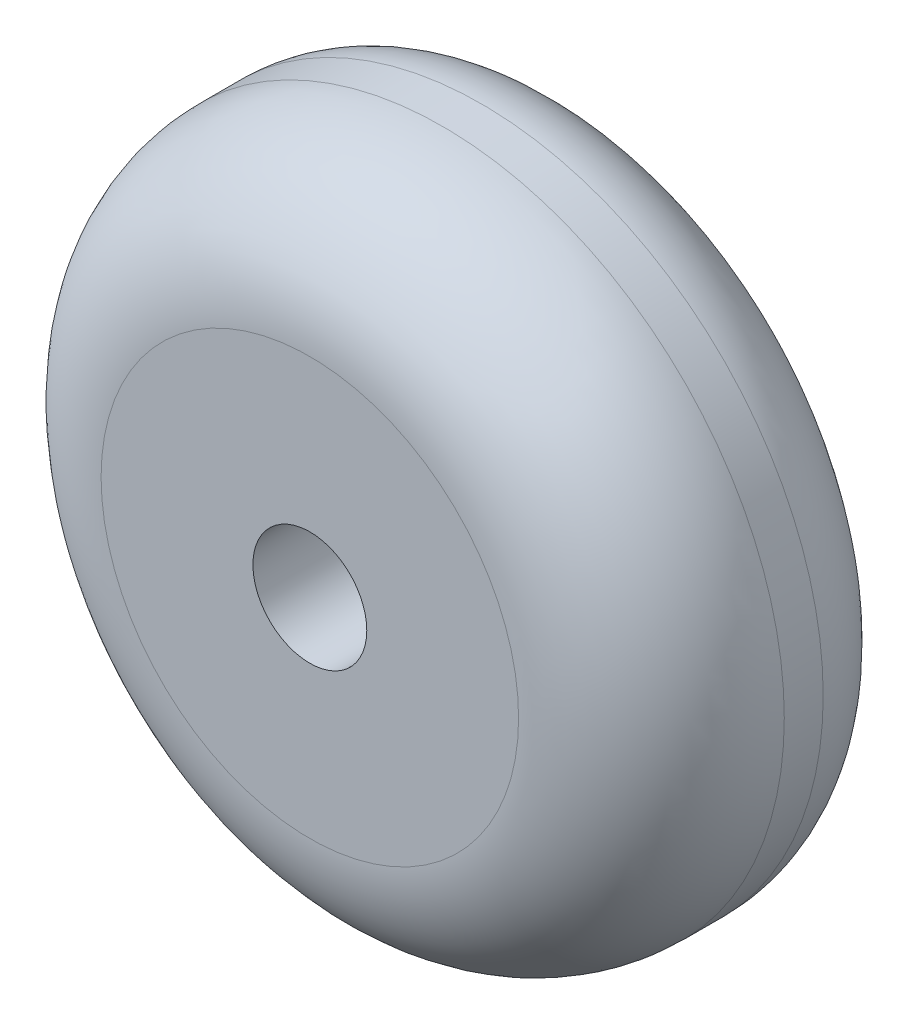
ISO-10303-21;
HEADER;
FILE_DESCRIPTION(('STEP AP214'),'2;1');
FILE_NAME('part.step','',(''),(''),'','','');
FILE_SCHEMA(('AUTOMOTIVE_DESIGN { 1 0 10303 214 1 1 1 1 }'));
ENDSEC;
DATA;
#1=APPLICATION_CONTEXT('core data for automotive mechanical design processes');
#2=APPLICATION_PROTOCOL_DEFINITION('international standard','automotive_design',2000,#1);
#3=PRODUCT_CONTEXT('',#1,'mechanical');
#4=PRODUCT('Part','Part','',(#3));
#5=PRODUCT_RELATED_PRODUCT_CATEGORY('part','',(#4));
#6=PRODUCT_DEFINITION_FORMATION('','',#4);
#7=PRODUCT_DEFINITION_CONTEXT('part definition',#1,'design');
#8=PRODUCT_DEFINITION('design','',#6,#7);
#9=PRODUCT_DEFINITION_SHAPE('','',#8);
#10=(LENGTH_UNIT() NAMED_UNIT(*) SI_UNIT(.MILLI.,.METRE.));
#11=(NAMED_UNIT(*) PLANE_ANGLE_UNIT() SI_UNIT($,.RADIAN.));
#12=(NAMED_UNIT(*) SI_UNIT($,.STERADIAN.) SOLID_ANGLE_UNIT());
#13=UNCERTAINTY_MEASURE_WITH_UNIT(LENGTH_MEASURE(1.E-05),#10,'distance_accuracy_value','');
#14=(GEOMETRIC_REPRESENTATION_CONTEXT(3) GLOBAL_UNCERTAINTY_ASSIGNED_CONTEXT((#13)) GLOBAL_UNIT_ASSIGNED_CONTEXT((#10,
#11,#12)) REPRESENTATION_CONTEXT('',''));
#15=CARTESIAN_POINT('',(0.,0.,0.));
#16=DIRECTION('',(0.,0.,1.));
#17=DIRECTION('',(1.,0.,0.));
#18=AXIS2_PLACEMENT_3D('',#15,#16,#17);
#19=CARTESIAN_POINT('',(0.,0.,4.94974746830583));
#20=DIRECTION('',(0.,0.,1.));
#21=DIRECTION('',(1.,0.,0.));
#22=AXIS2_PLACEMENT_3D('',#19,#20,#21);
#23=TOROIDAL_SURFACE('',#22,13.0502525316942,4.94974746830583);
#24=CARTESIAN_POINT('',(0.,0.,4.94974746830583));
#25=DIRECTION('',(0.,0.,1.));
#26=DIRECTION('',(1.,0.,0.));
#27=AXIS2_PLACEMENT_3D('',#24,#25,#26);
#28=CIRCLE('',#27,18.);
#29=CARTESIAN_POINT('',(18.,0.,4.94974746830583));
#30=VERTEX_POINT('',#29);
#31=EDGE_CURVE('E47',#30,#30,#28,.T.);
#32=ORIENTED_EDGE('',*,*,#31,.F.);
#33=EDGE_LOOP('',(#32));
#34=FACE_BOUND('',#33,.T.);
#35=CARTESIAN_POINT('',(0.,0.,0.));
#36=DIRECTION('',(0.,0.,1.));
#37=DIRECTION('',(1.,0.,0.));
#38=AXIS2_PLACEMENT_3D('',#35,#36,#37);
#39=CIRCLE('',#38,13.0502525316942);
#40=CARTESIAN_POINT('',(13.0502525316942,0.,0.));
#41=VERTEX_POINT('',#40);
#42=EDGE_CURVE('E10',#41,#41,#39,.F.);
#43=ORIENTED_EDGE('',*,*,#42,.F.);
#44=EDGE_LOOP('',(#43));
#45=FACE_BOUND('',#44,.T.);
#46=ADVANCED_FACE('F39',(#34,#45),#23,.T.);
#47=CARTESIAN_POINT('',(0.,0.,7.));
#48=DIRECTION('',(0.,0.,1.));
#49=DIRECTION('',(1.,0.,0.));
#50=AXIS2_PLACEMENT_3D('',#47,#48,#49);
#51=TOROIDAL_SURFACE('',#50,11.,7.);
#52=CARTESIAN_POINT('',(0.,0.,7.));
#53=DIRECTION('',(0.,0.,1.));
#54=DIRECTION('',(1.,0.,0.));
#55=AXIS2_PLACEMENT_3D('',#52,#53,#54);
#56=CIRCLE('',#55,18.);
#57=CARTESIAN_POINT('',(18.,0.,7.));
#58=VERTEX_POINT('',#57);
#59=EDGE_CURVE('E57',#58,#58,#56,.F.);
#60=ORIENTED_EDGE('',*,*,#59,.F.);
#61=EDGE_LOOP('',(#60));
#62=FACE_BOUND('',#61,.T.);
#63=CARTESIAN_POINT('',(0.,0.,14.));
#64=DIRECTION('',(0.,0.,1.));
#65=DIRECTION('',(1.,0.,0.));
#66=AXIS2_PLACEMENT_3D('',#63,#64,#65);
#67=CIRCLE('',#66,11.);
#68=CARTESIAN_POINT('',(11.,0.,14.));
#69=VERTEX_POINT('',#68);
#70=EDGE_CURVE('E52',#69,#69,#67,.T.);
#71=ORIENTED_EDGE('',*,*,#70,.F.);
#72=EDGE_LOOP('',(#71));
#73=FACE_BOUND('',#72,.T.);
#74=ADVANCED_FACE('F87',(#62,#73),#51,.T.);
#75=CARTESIAN_POINT('',(0.,0.,14.));
#76=DIRECTION('',(0.,0.,-1.));
#77=DIRECTION('',(-1.,0.,0.));
#78=AXIS2_PLACEMENT_3D('',#75,#76,#77);
#79=CYLINDRICAL_SURFACE('',#78,18.);
#80=ORIENTED_EDGE('',*,*,#31,.T.);
#81=EDGE_LOOP('',(#80));
#82=FACE_BOUND('',#81,.T.);
#83=ORIENTED_EDGE('',*,*,#59,.T.);
#84=EDGE_LOOP('',(#83));
#85=FACE_BOUND('',#84,.T.);
#86=ADVANCED_FACE('F83',(#82,#85),#79,.T.);
#87=CARTESIAN_POINT('',(0.,0.,14.));
#88=DIRECTION('',(0.,0.,1.));
#89=DIRECTION('',(1.,0.,0.));
#90=AXIS2_PLACEMENT_3D('',#87,#88,#89);
#91=PLANE('',#90);
#92=CARTESIAN_POINT('',(0.,0.,14.));
#93=DIRECTION('',(0.,0.,1.));
#94=DIRECTION('',(1.,0.,0.));
#95=AXIS2_PLACEMENT_3D('',#92,#93,#94);
#96=CIRCLE('',#95,3.);
#97=CARTESIAN_POINT('',(3.,0.,14.));
#98=VERTEX_POINT('',#97);
#99=EDGE_CURVE('E64',#98,#98,#96,.T.);
#100=ORIENTED_EDGE('',*,*,#99,.F.);
#101=EDGE_LOOP('',(#100));
#102=FACE_BOUND('',#101,.T.);
#103=ORIENTED_EDGE('',*,*,#70,.T.);
#104=EDGE_LOOP('',(#103));
#105=FACE_BOUND('',#104,.T.);
#106=ADVANCED_FACE('F80',(#102,#105),#91,.T.);
#107=CARTESIAN_POINT('',(0.,0.,0.));
#108=DIRECTION('',(0.,0.,1.));
#109=DIRECTION('',(1.,0.,0.));
#110=AXIS2_PLACEMENT_3D('',#107,#108,#109);
#111=PLANE('',#110);
#112=CARTESIAN_POINT('',(0.,0.,0.));
#113=DIRECTION('',(0.,0.,1.));
#114=DIRECTION('',(1.,0.,0.));
#115=AXIS2_PLACEMENT_3D('',#112,#113,#114);
#116=CIRCLE('',#115,3.);
#117=CARTESIAN_POINT('',(3.,0.,0.));
#118=VERTEX_POINT('',#117);
#119=EDGE_CURVE('E63',#118,#118,#116,.T.);
#120=ORIENTED_EDGE('',*,*,#119,.T.);
#121=EDGE_LOOP('',(#120));
#122=FACE_BOUND('',#121,.T.);
#123=ORIENTED_EDGE('',*,*,#42,.T.);
#124=EDGE_LOOP('',(#123));
#125=FACE_BOUND('',#124,.T.);
#126=ADVANCED_FACE('F72',(#122,#125),#111,.F.);
#127=CARTESIAN_POINT('',(0.,0.,0.));
#128=DIRECTION('',(0.,0.,1.));
#129=DIRECTION('',(1.,0.,0.));
#130=AXIS2_PLACEMENT_3D('',#127,#128,#129);
#131=CYLINDRICAL_SURFACE('',#130,3.);
#132=ORIENTED_EDGE('',*,*,#119,.F.);
#133=EDGE_LOOP('',(#132));
#134=FACE_BOUND('',#133,.T.);
#135=ORIENTED_EDGE('',*,*,#99,.T.);
#136=EDGE_LOOP('',(#135));
#137=FACE_BOUND('',#136,.T.);
#138=ADVANCED_FACE('F74',(#134,#137),#131,.F.);
#139=CLOSED_SHELL('',(#46,#74,#86,#106,#126,#138));
#140=MANIFOLD_SOLID_BREP('B2',#139);
#141=ADVANCED_BREP_SHAPE_REPRESENTATION('',(#18,#140),#14);
#142=SHAPE_DEFINITION_REPRESENTATION(#9,#141);
ENDSEC;
END-ISO-10303-21;
